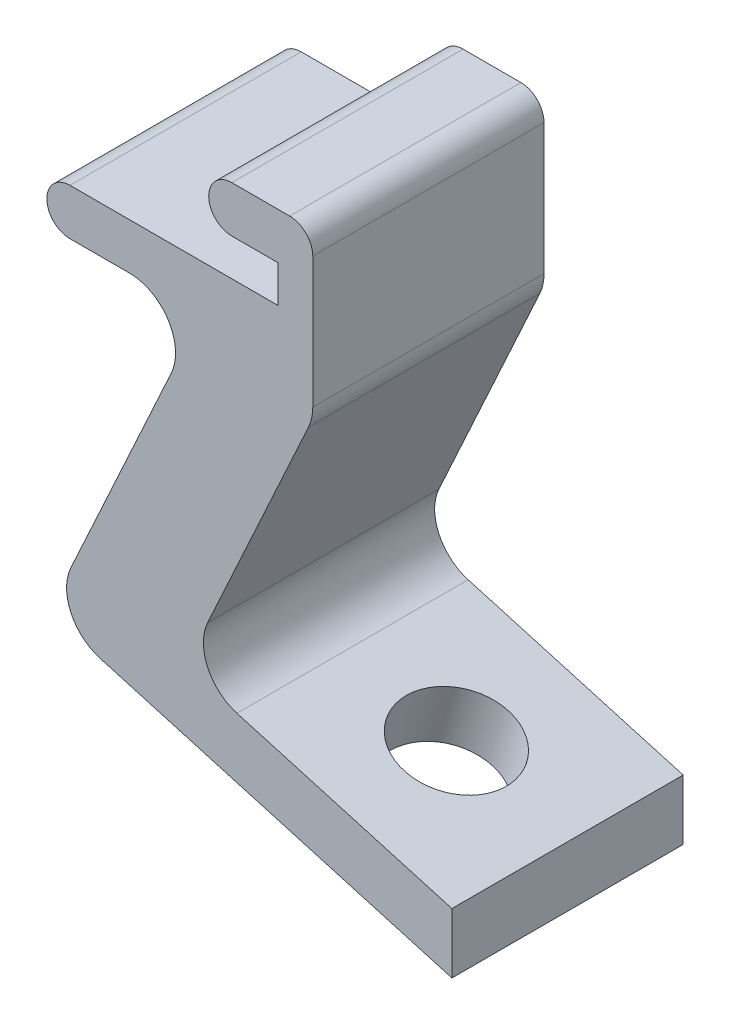
ISO-10303-21;
HEADER;
FILE_DESCRIPTION(('STEP AP214'),'2;1');
FILE_NAME('part.step','',(''),(''),'','','');
FILE_SCHEMA(('AUTOMOTIVE_DESIGN { 1 0 10303 214 1 1 1 1 }'));
ENDSEC;
DATA;
#1=APPLICATION_CONTEXT('core data for automotive mechanical design processes');
#2=APPLICATION_PROTOCOL_DEFINITION('international standard','automotive_design',2000,#1);
#3=PRODUCT_CONTEXT('',#1,'mechanical');
#4=PRODUCT('Part','Part','',(#3));
#5=PRODUCT_RELATED_PRODUCT_CATEGORY('part','',(#4));
#6=PRODUCT_DEFINITION_FORMATION('','',#4);
#7=PRODUCT_DEFINITION_CONTEXT('part definition',#1,'design');
#8=PRODUCT_DEFINITION('design','',#6,#7);
#9=PRODUCT_DEFINITION_SHAPE('','',#8);
#10=(LENGTH_UNIT() NAMED_UNIT(*) SI_UNIT(.MILLI.,.METRE.));
#11=(NAMED_UNIT(*) PLANE_ANGLE_UNIT() SI_UNIT($,.RADIAN.));
#12=(NAMED_UNIT(*) SI_UNIT($,.STERADIAN.) SOLID_ANGLE_UNIT());
#13=UNCERTAINTY_MEASURE_WITH_UNIT(LENGTH_MEASURE(1.E-05),#10,'distance_accuracy_value','');
#14=(GEOMETRIC_REPRESENTATION_CONTEXT(3) GLOBAL_UNCERTAINTY_ASSIGNED_CONTEXT((#13)) GLOBAL_UNIT_ASSIGNED_CONTEXT((#10,
#11,#12)) REPRESENTATION_CONTEXT('',''));
#15=CARTESIAN_POINT('',(0.,0.,0.));
#16=DIRECTION('',(0.,0.,1.));
#17=DIRECTION('',(1.,0.,0.));
#18=AXIS2_PLACEMENT_3D('',#15,#16,#17);
#19=CARTESIAN_POINT('',(-5.64587358932212,-8.77244875286067,10.));
#20=DIRECTION('',(0.,0.,-1.));
#21=DIRECTION('',(-1.,0.,0.));
#22=AXIS2_PLACEMENT_3D('',#19,#20,#21);
#23=CYLINDRICAL_SURFACE('',#22,2.);
#24=CARTESIAN_POINT('',(-5.64587358932212,-8.77244875286067,0.));
#25=DIRECTION('',(0.,0.,1.));
#26=DIRECTION('',(1.,0.,0.));
#27=AXIS2_PLACEMENT_3D('',#24,#25,#26);
#28=CIRCLE('',#27,2.);
#29=CARTESIAN_POINT('',(-7.46359977285942,-7.93825961262753,0.));
#30=VERTEX_POINT('',#29);
#31=CARTESIAN_POINT('',(-6.19714830095609,-10.6949721447373,0.));
#32=VERTEX_POINT('',#31);
#33=EDGE_CURVE('E194',#30,#32,#28,.T.);
#34=ORIENTED_EDGE('',*,*,#33,.T.);
#35=DIRECTION('',(0.,0.,-1.));
#36=VECTOR('',#35,1.);
#37=CARTESIAN_POINT('',(-6.19714830095609,-10.6949721447373,10.));
#38=LINE('',#37,#36);
#39=CARTESIAN_POINT('',(-6.19714830095609,-10.6949721447373,10.));
#40=VERTEX_POINT('',#39);
#41=EDGE_CURVE('E176',#40,#32,#38,.T.);
#42=ORIENTED_EDGE('',*,*,#41,.F.);
#43=CARTESIAN_POINT('',(-5.64587358932212,-8.77244875286067,10.));
#44=DIRECTION('',(0.,0.,1.));
#45=DIRECTION('',(1.,0.,0.));
#46=AXIS2_PLACEMENT_3D('',#43,#44,#45);
#47=CIRCLE('',#46,2.);
#48=CARTESIAN_POINT('',(-7.46359977285942,-7.93825961262753,10.));
#49=VERTEX_POINT('',#48);
#50=EDGE_CURVE('E182',#49,#40,#47,.T.);
#51=ORIENTED_EDGE('',*,*,#50,.F.);
#52=DIRECTION('',(0.,0.,-1.));
#53=VECTOR('',#52,1.);
#54=CARTESIAN_POINT('',(-7.46359977285942,-7.93825961262753,10.));
#55=LINE('',#54,#53);
#56=EDGE_CURVE('E274',#49,#30,#55,.T.);
#57=ORIENTED_EDGE('',*,*,#56,.T.);
#58=EDGE_LOOP('',(#34,#42,#51,#57));
#59=FACE_BOUND('',#58,.T.);
#60=ADVANCED_FACE('F36',(#59),#23,.T.);
#61=CARTESIAN_POINT('',(9.01718824571801,-15.0576129468776,10.));
#62=DIRECTION('',(0.275637355816992,0.961261695938321,0.));
#63=DIRECTION('',(-0.961261695938321,0.275637355816992,0.));
#64=AXIS2_PLACEMENT_3D('',#61,#62,#63);
#65=PLANE('',#64);
#66=CARTESIAN_POINT('',(3.52178637648393,-13.4818318179844,5.));
#67=DIRECTION('',(0.275637355816992,0.961261695938321,0.));
#68=DIRECTION('',(-0.961261695938321,0.275637355816992,0.));
#69=AXIS2_PLACEMENT_3D('',#66,#67,#68);
#70=CIRCLE('',#69,2.25);
#71=CARTESIAN_POINT('',(1.3589475606227,-12.8616477673962,5.));
#72=VERTEX_POINT('',#71);
#73=EDGE_CURVE('E237',#72,#72,#70,.T.);
#74=ORIENTED_EDGE('',*,*,#73,.T.);
#75=EDGE_LOOP('',(#74));
#76=FACE_BOUND('',#75,.T.);
#77=DIRECTION('',(0.961261695938321,-0.275637355816992,0.));
#78=VECTOR('',#77,1.);
#79=CARTESIAN_POINT('',(9.01718824571801,-15.0576129468776,0.));
#80=LINE('',#79,#78);
#81=CARTESIAN_POINT('',(9.01718824571801,-15.0576129468776,0.));
#82=VERTEX_POINT('',#81);
#83=EDGE_CURVE('E234',#32,#82,#80,.T.);
#84=ORIENTED_EDGE('',*,*,#83,.T.);
#85=DIRECTION('',(0.,0.,-1.));
#86=VECTOR('',#85,1.);
#87=CARTESIAN_POINT('',(9.01718824571801,-15.0576129468776,10.));
#88=LINE('',#87,#86);
#89=CARTESIAN_POINT('',(9.01718824571801,-15.0576129468776,10.));
#90=VERTEX_POINT('',#89);
#91=EDGE_CURVE('E179',#90,#82,#88,.T.);
#92=ORIENTED_EDGE('',*,*,#91,.F.);
#93=DIRECTION('',(0.961261695938321,-0.275637355816992,0.));
#94=VECTOR('',#93,1.);
#95=CARTESIAN_POINT('',(9.01718824571801,-15.0576129468776,10.));
#96=LINE('',#95,#94);
#97=EDGE_CURVE('E172',#40,#90,#96,.T.);
#98=ORIENTED_EDGE('',*,*,#97,.F.);
#99=ORIENTED_EDGE('',*,*,#41,.T.);
#100=EDGE_LOOP('',(#84,#92,#98,#99));
#101=FACE_BOUND('',#100,.T.);
#102=ADVANCED_FACE('F174',(#76,#101),#65,.F.);
#103=CARTESIAN_POINT('',(9.01718824571801,-12.4568643572236,10.));
#104=DIRECTION('',(-1.,0.,0.));
#105=DIRECTION('',(0.,0.,1.));
#106=AXIS2_PLACEMENT_3D('',#103,#104,#105);
#107=PLANE('',#106);
#108=DIRECTION('',(0.,1.,0.));
#109=VECTOR('',#108,1.);
#110=CARTESIAN_POINT('',(9.01718824571801,-12.4568643572236,0.));
#111=LINE('',#110,#109);
#112=CARTESIAN_POINT('',(9.01718824571801,-12.4568643572236,0.));
#113=VERTEX_POINT('',#112);
#114=EDGE_CURVE('E277',#82,#113,#111,.T.);
#115=ORIENTED_EDGE('',*,*,#114,.T.);
#116=DIRECTION('',(0.,0.,-1.));
#117=VECTOR('',#116,1.);
#118=CARTESIAN_POINT('',(9.01718824571801,-12.4568643572236,10.));
#119=LINE('',#118,#117);
#120=CARTESIAN_POINT('',(9.01718824571801,-12.4568643572236,10.));
#121=VERTEX_POINT('',#120);
#122=EDGE_CURVE('E199',#121,#113,#119,.T.);
#123=ORIENTED_EDGE('',*,*,#122,.F.);
#124=DIRECTION('',(0.,1.,0.));
#125=VECTOR('',#124,1.);
#126=CARTESIAN_POINT('',(9.01718824571801,-12.4568643572236,10.));
#127=LINE('',#126,#125);
#128=EDGE_CURVE('E181',#90,#121,#127,.T.);
#129=ORIENTED_EDGE('',*,*,#128,.F.);
#130=ORIENTED_EDGE('',*,*,#91,.T.);
#131=EDGE_LOOP('',(#115,#123,#129,#130));
#132=FACE_BOUND('',#131,.T.);
#133=ADVANCED_FACE('F354',(#132),#107,.F.);
#134=CARTESIAN_POINT('',(-0.280787764041095,-9.79071263952915,10.));
#135=DIRECTION('',(-0.275637355816992,-0.961261695938321,0.));
#136=DIRECTION('',(0.961261695938321,-0.275637355816992,0.));
#137=AXIS2_PLACEMENT_3D('',#134,#135,#136);
#138=PLANE('',#137);
#139=CARTESIAN_POINT('',(4.21087976602641,-11.0786775781386,5.));
#140=DIRECTION('',(0.275637355816992,0.961261695938321,0.));
#141=DIRECTION('',(-0.961261695938321,0.275637355816992,0.));
#142=AXIS2_PLACEMENT_3D('',#139,#140,#141);
#143=CIRCLE('',#142,2.25);
#144=CARTESIAN_POINT('',(2.04804095016518,-10.4584935275504,5.));
#145=VERTEX_POINT('',#144);
#146=EDGE_CURVE('E242',#145,#145,#143,.T.);
#147=ORIENTED_EDGE('',*,*,#146,.F.);
#148=EDGE_LOOP('',(#147));
#149=FACE_BOUND('',#148,.T.);
#150=DIRECTION('',(-0.961261695938321,0.275637355816992,0.));
#151=VECTOR('',#150,1.);
#152=CARTESIAN_POINT('',(-0.280787764041095,-9.79071263952915,0.));
#153=LINE('',#152,#151);
#154=CARTESIAN_POINT('',(-0.280787764041095,-9.79071263952915,0.));
#155=VERTEX_POINT('',#154);
#156=EDGE_CURVE('E279',#113,#155,#153,.T.);
#157=ORIENTED_EDGE('',*,*,#156,.T.);
#158=DIRECTION('',(0.,0.,-1.));
#159=VECTOR('',#158,1.);
#160=CARTESIAN_POINT('',(-0.280787764041095,-9.79071263952915,10.));
#161=LINE('',#160,#159);
#162=CARTESIAN_POINT('',(-0.280787764041095,-9.79071263952915,10.));
#163=VERTEX_POINT('',#162);
#164=EDGE_CURVE('E327',#163,#155,#161,.T.);
#165=ORIENTED_EDGE('',*,*,#164,.F.);
#166=DIRECTION('',(-0.961261695938321,0.275637355816992,0.));
#167=VECTOR('',#166,1.);
#168=CARTESIAN_POINT('',(-0.280787764041095,-9.79071263952915,10.));
#169=LINE('',#168,#167);
#170=EDGE_CURVE('E250',#121,#163,#169,.T.);
#171=ORIENTED_EDGE('',*,*,#170,.F.);
#172=ORIENTED_EDGE('',*,*,#122,.T.);
#173=EDGE_LOOP('',(#157,#165,#171,#172));
#174=FACE_BOUND('',#173,.T.);
#175=ADVANCED_FACE('F334',(#149,#174),#138,.F.);
#176=CARTESIAN_POINT('',(0.270486947592873,-7.8681892476525,10.));
#177=DIRECTION('',(0.,0.,-1.));
#178=DIRECTION('',(-1.,0.,0.));
#179=AXIS2_PLACEMENT_3D('',#176,#177,#178);
#180=CYLINDRICAL_SURFACE('',#179,2.);
#181=CARTESIAN_POINT('',(0.270486947592873,-7.8681892476525,0.));
#182=DIRECTION('',(0.,0.,-1.));
#183=DIRECTION('',(-1.,0.,0.));
#184=AXIS2_PLACEMENT_3D('',#181,#182,#183);
#185=CIRCLE('',#184,2.);
#186=CARTESIAN_POINT('',(-1.54723923594443,-7.03400010741936,0.));
#187=VERTEX_POINT('',#186);
#188=EDGE_CURVE('E281',#155,#187,#185,.T.);
#189=ORIENTED_EDGE('',*,*,#188,.T.);
#190=DIRECTION('',(0.,0.,-1.));
#191=VECTOR('',#190,1.);
#192=CARTESIAN_POINT('',(-1.54723923594443,-7.03400010741936,10.));
#193=LINE('',#192,#191);
#194=CARTESIAN_POINT('',(-1.54723923594443,-7.03400010741936,10.));
#195=VERTEX_POINT('',#194);
#196=EDGE_CURVE('E324',#195,#187,#193,.T.);
#197=ORIENTED_EDGE('',*,*,#196,.F.);
#198=CARTESIAN_POINT('',(0.270486947592873,-7.8681892476525,10.));
#199=DIRECTION('',(0.,0.,-1.));
#200=DIRECTION('',(-1.,0.,0.));
#201=AXIS2_PLACEMENT_3D('',#198,#199,#200);
#202=CIRCLE('',#201,2.);
#203=EDGE_CURVE('E252',#163,#195,#202,.T.);
#204=ORIENTED_EDGE('',*,*,#203,.F.);
#205=ORIENTED_EDGE('',*,*,#164,.T.);
#206=EDGE_LOOP('',(#189,#197,#204,#205));
#207=FACE_BOUND('',#206,.T.);
#208=ADVANCED_FACE('F346',(#207),#180,.F.);
#209=CARTESIAN_POINT('',(2.81772618353731,2.47740629977682,10.));
#210=DIRECTION('',(-0.908863091768655,0.417094570116565,0.));
#211=DIRECTION('',(-0.417094570116565,-0.908863091768655,0.));
#212=AXIS2_PLACEMENT_3D('',#209,#210,#211);
#213=PLANE('',#212);
#214=DIRECTION('',(0.417094570116565,0.908863091768655,0.));
#215=VECTOR('',#214,1.);
#216=CARTESIAN_POINT('',(2.81772618353731,2.47740629977682,0.));
#217=LINE('',#216,#215);
#218=CARTESIAN_POINT('',(2.81772618353731,2.47740629977682,0.));
#219=VERTEX_POINT('',#218);
#220=EDGE_CURVE('E283',#187,#219,#217,.T.);
#221=ORIENTED_EDGE('',*,*,#220,.T.);
#222=DIRECTION('',(0.,0.,-1.));
#223=VECTOR('',#222,1.);
#224=CARTESIAN_POINT('',(2.81772618353731,2.47740629977682,10.));
#225=LINE('',#224,#223);
#226=CARTESIAN_POINT('',(2.81772618353731,2.47740629977682,10.));
#227=VERTEX_POINT('',#226);
#228=EDGE_CURVE('E321',#227,#219,#225,.T.);
#229=ORIENTED_EDGE('',*,*,#228,.F.);
#230=DIRECTION('',(0.417094570116565,0.908863091768655,0.));
#231=VECTOR('',#230,1.);
#232=CARTESIAN_POINT('',(2.81772618353731,2.47740629977682,10.));
#233=LINE('',#232,#231);
#234=EDGE_CURVE('E254',#195,#227,#233,.T.);
#235=ORIENTED_EDGE('',*,*,#234,.F.);
#236=ORIENTED_EDGE('',*,*,#196,.T.);
#237=EDGE_LOOP('',(#221,#229,#235,#236));
#238=FACE_BOUND('',#237,.T.);
#239=ADVANCED_FACE('F350',(#238),#213,.F.);
#240=CARTESIAN_POINT('',(1.,3.31159544000995,10.));
#241=DIRECTION('',(0.,0.,-1.));
#242=DIRECTION('',(-1.,0.,0.));
#243=AXIS2_PLACEMENT_3D('',#240,#241,#242);
#244=CYLINDRICAL_SURFACE('',#243,2.);
#245=CARTESIAN_POINT('',(1.,3.31159544000995,0.));
#246=DIRECTION('',(0.,0.,1.));
#247=DIRECTION('',(-1.,0.,0.));
#248=AXIS2_PLACEMENT_3D('',#245,#246,#247);
#249=CIRCLE('',#248,2.);
#250=CARTESIAN_POINT('',(3.,3.31159544000996,0.));
#251=VERTEX_POINT('',#250);
#252=EDGE_CURVE('E285',#219,#251,#249,.T.);
#253=ORIENTED_EDGE('',*,*,#252,.T.);
#254=DIRECTION('',(0.,0.,-1.));
#255=VECTOR('',#254,1.);
#256=CARTESIAN_POINT('',(3.,3.31159544000996,10.));
#257=LINE('',#256,#255);
#258=CARTESIAN_POINT('',(3.,3.31159544000996,10.));
#259=VERTEX_POINT('',#258);
#260=EDGE_CURVE('E318',#259,#251,#257,.T.);
#261=ORIENTED_EDGE('',*,*,#260,.F.);
#262=CARTESIAN_POINT('',(1.,3.31159544000995,10.));
#263=DIRECTION('',(0.,0.,1.));
#264=DIRECTION('',(-1.,0.,0.));
#265=AXIS2_PLACEMENT_3D('',#262,#263,#264);
#266=CIRCLE('',#265,2.);
#267=EDGE_CURVE('E256',#227,#259,#266,.T.);
#268=ORIENTED_EDGE('',*,*,#267,.F.);
#269=ORIENTED_EDGE('',*,*,#228,.T.);
#270=EDGE_LOOP('',(#253,#261,#268,#269));
#271=FACE_BOUND('',#270,.T.);
#272=ADVANCED_FACE('F440',(#271),#244,.T.);
#273=CARTESIAN_POINT('',(3.,9.97008309957838,10.));
#274=DIRECTION('',(-1.,0.,0.));
#275=DIRECTION('',(0.,0.,1.));
#276=AXIS2_PLACEMENT_3D('',#273,#274,#275);
#277=PLANE('',#276);
#278=DIRECTION('',(0.,1.,0.));
#279=VECTOR('',#278,1.);
#280=CARTESIAN_POINT('',(3.,9.97008309957838,0.));
#281=LINE('',#280,#279);
#282=CARTESIAN_POINT('',(3.,8.97008309957838,0.));
#283=VERTEX_POINT('',#282);
#284=EDGE_CURVE('E287',#251,#283,#281,.T.);
#285=ORIENTED_EDGE('',*,*,#284,.T.);
#286=DIRECTION('',(0.,0.,-1.));
#287=VECTOR('',#286,1.);
#288=CARTESIAN_POINT('',(3.,8.97008309957838,10.));
#289=LINE('',#288,#287);
#290=CARTESIAN_POINT('',(3.,8.97008309957838,10.));
#291=VERTEX_POINT('',#290);
#292=EDGE_CURVE('E45',#283,#291,#289,.F.);
#293=ORIENTED_EDGE('',*,*,#292,.T.);
#294=DIRECTION('',(0.,1.,0.));
#295=VECTOR('',#294,1.);
#296=CARTESIAN_POINT('',(3.,9.97008309957838,10.));
#297=LINE('',#296,#295);
#298=EDGE_CURVE('E258',#259,#291,#297,.T.);
#299=ORIENTED_EDGE('',*,*,#298,.F.);
#300=ORIENTED_EDGE('',*,*,#260,.T.);
#301=EDGE_LOOP('',(#285,#293,#299,#300));
#302=FACE_BOUND('',#301,.T.);
#303=ADVANCED_FACE('F436',(#302),#277,.F.);
#304=CARTESIAN_POINT('',(-1.5,9.97008309957838,10.));
#305=DIRECTION('',(0.,-1.,0.));
#306=DIRECTION('',(0.,0.,-1.));
#307=AXIS2_PLACEMENT_3D('',#304,#305,#306);
#308=PLANE('',#307);
#309=DIRECTION('',(-1.,0.,0.));
#310=VECTOR('',#309,1.);
#311=CARTESIAN_POINT('',(-1.5,9.97008309957838,0.));
#312=LINE('',#311,#310);
#313=CARTESIAN_POINT('',(2.,9.97008309957838,0.));
#314=VERTEX_POINT('',#313);
#315=CARTESIAN_POINT('',(-0.5,9.97008309957838,0.));
#316=VERTEX_POINT('',#315);
#317=EDGE_CURVE('E290',#314,#316,#312,.T.);
#318=ORIENTED_EDGE('',*,*,#317,.T.);
#319=DIRECTION('',(0.,0.,-1.));
#320=VECTOR('',#319,1.);
#321=CARTESIAN_POINT('',(-0.5,9.97008309957838,10.));
#322=LINE('',#321,#320);
#323=CARTESIAN_POINT('',(-0.5,9.97008309957838,10.));
#324=VERTEX_POINT('',#323);
#325=EDGE_CURVE('E227',#316,#324,#322,.F.);
#326=ORIENTED_EDGE('',*,*,#325,.T.);
#327=DIRECTION('',(-1.,0.,0.));
#328=VECTOR('',#327,1.);
#329=CARTESIAN_POINT('',(-1.5,9.97008309957838,10.));
#330=LINE('',#329,#328);
#331=CARTESIAN_POINT('',(2.,9.97008309957838,10.));
#332=VERTEX_POINT('',#331);
#333=EDGE_CURVE('E261',#332,#324,#330,.T.);
#334=ORIENTED_EDGE('',*,*,#333,.F.);
#335=DIRECTION('',(0.,0.,-1.));
#336=VECTOR('',#335,1.);
#337=CARTESIAN_POINT('',(2.,9.97008309957838,10.));
#338=LINE('',#337,#336);
#339=EDGE_CURVE('E224',#332,#314,#338,.T.);
#340=ORIENTED_EDGE('',*,*,#339,.T.);
#341=EDGE_LOOP('',(#318,#326,#334,#340));
#342=FACE_BOUND('',#341,.T.);
#343=ADVANCED_FACE('F433',(#342),#308,.F.);
#344=CARTESIAN_POINT('',(-1.5,7.97008309957838,10.));
#345=DIRECTION('',(0.,1.,0.));
#346=DIRECTION('',(0.,0.,1.));
#347=AXIS2_PLACEMENT_3D('',#344,#345,#346);
#348=PLANE('',#347);
#349=DIRECTION('',(1.,0.,0.));
#350=VECTOR('',#349,1.);
#351=CARTESIAN_POINT('',(-1.5,7.97008309957838,10.));
#352=LINE('',#351,#350);
#353=CARTESIAN_POINT('',(-0.5,7.97008309957838,10.));
#354=VERTEX_POINT('',#353);
#355=CARTESIAN_POINT('',(1.5,7.97008309957838,10.));
#356=VERTEX_POINT('',#355);
#357=EDGE_CURVE('E264',#354,#356,#352,.T.);
#358=ORIENTED_EDGE('',*,*,#357,.F.);
#359=DIRECTION('',(0.,0.,-1.));
#360=VECTOR('',#359,1.);
#361=CARTESIAN_POINT('',(-0.5,7.97008309957838,10.));
#362=LINE('',#361,#360);
#363=CARTESIAN_POINT('',(-0.5,7.97008309957838,0.));
#364=VERTEX_POINT('',#363);
#365=EDGE_CURVE('E221',#354,#364,#362,.T.);
#366=ORIENTED_EDGE('',*,*,#365,.T.);
#367=DIRECTION('',(1.,0.,0.));
#368=VECTOR('',#367,1.);
#369=CARTESIAN_POINT('',(-1.5,7.97008309957838,0.));
#370=LINE('',#369,#368);
#371=CARTESIAN_POINT('',(1.5,7.97008309957838,0.));
#372=VERTEX_POINT('',#371);
#373=EDGE_CURVE('E293',#364,#372,#370,.T.);
#374=ORIENTED_EDGE('',*,*,#373,.T.);
#375=DIRECTION('',(0.,0.,-1.));
#376=VECTOR('',#375,1.);
#377=CARTESIAN_POINT('',(1.5,7.97008309957838,10.));
#378=LINE('',#377,#376);
#379=EDGE_CURVE('E315',#356,#372,#378,.T.);
#380=ORIENTED_EDGE('',*,*,#379,.F.);
#381=EDGE_LOOP('',(#358,#366,#374,#380));
#382=FACE_BOUND('',#381,.T.);
#383=ADVANCED_FACE('F390',(#382),#348,.F.);
#384=CARTESIAN_POINT('',(1.5,7.97008309957838,10.));
#385=DIRECTION('',(1.,0.,0.));
#386=DIRECTION('',(0.,0.,-1.));
#387=AXIS2_PLACEMENT_3D('',#384,#385,#386);
#388=PLANE('',#387);
#389=DIRECTION('',(0.,-1.,0.));
#390=VECTOR('',#389,1.);
#391=CARTESIAN_POINT('',(1.5,7.97008309957838,0.));
#392=LINE('',#391,#390);
#393=CARTESIAN_POINT('',(1.5,6.37008309957838,0.));
#394=VERTEX_POINT('',#393);
#395=EDGE_CURVE('E295',#372,#394,#392,.T.);
#396=ORIENTED_EDGE('',*,*,#395,.T.);
#397=DIRECTION('',(0.,0.,-1.));
#398=VECTOR('',#397,1.);
#399=CARTESIAN_POINT('',(1.5,6.37008309957838,10.));
#400=LINE('',#399,#398);
#401=CARTESIAN_POINT('',(1.5,6.37008309957838,10.));
#402=VERTEX_POINT('',#401);
#403=EDGE_CURVE('E312',#402,#394,#400,.T.);
#404=ORIENTED_EDGE('',*,*,#403,.F.);
#405=DIRECTION('',(0.,-1.,0.));
#406=VECTOR('',#405,1.);
#407=CARTESIAN_POINT('',(1.5,7.97008309957838,10.));
#408=LINE('',#407,#406);
#409=EDGE_CURVE('E266',#356,#402,#408,.T.);
#410=ORIENTED_EDGE('',*,*,#409,.F.);
#411=ORIENTED_EDGE('',*,*,#379,.T.);
#412=EDGE_LOOP('',(#396,#404,#410,#411));
#413=FACE_BOUND('',#412,.T.);
#414=ADVANCED_FACE('F395',(#413),#388,.F.);
#415=CARTESIAN_POINT('',(1.5,6.37008309957838,10.));
#416=DIRECTION('',(0.,-1.,0.));
#417=DIRECTION('',(1.,0.,0.));
#418=AXIS2_PLACEMENT_3D('',#415,#416,#417);
#419=PLANE('',#418);
#420=DIRECTION('',(-1.,0.,0.));
#421=VECTOR('',#420,1.);
#422=CARTESIAN_POINT('',(1.5,6.37008309957838,0.));
#423=LINE('',#422,#421);
#424=CARTESIAN_POINT('',(-7.5,6.37008309957838,0.));
#425=VERTEX_POINT('',#424);
#426=EDGE_CURVE('E297',#394,#425,#423,.T.);
#427=ORIENTED_EDGE('',*,*,#426,.T.);
#428=DIRECTION('',(0.,0.,-1.));
#429=VECTOR('',#428,1.);
#430=CARTESIAN_POINT('',(-7.5,6.37008309957838,10.));
#431=LINE('',#430,#429);
#432=CARTESIAN_POINT('',(-7.5,6.37008309957838,10.));
#433=VERTEX_POINT('',#432);
#434=EDGE_CURVE('E210',#425,#433,#431,.F.);
#435=ORIENTED_EDGE('',*,*,#434,.T.);
#436=DIRECTION('',(-1.,0.,0.));
#437=VECTOR('',#436,1.);
#438=CARTESIAN_POINT('',(1.5,6.37008309957838,10.));
#439=LINE('',#438,#437);
#440=EDGE_CURVE('E268',#402,#433,#439,.T.);
#441=ORIENTED_EDGE('',*,*,#440,.F.);
#442=ORIENTED_EDGE('',*,*,#403,.T.);
#443=EDGE_LOOP('',(#427,#435,#441,#442));
#444=FACE_BOUND('',#443,.T.);
#445=ADVANCED_FACE('F398',(#444),#419,.F.);
#446=CARTESIAN_POINT('',(-8.5,4.37008309957838,10.));
#447=DIRECTION('',(0.,1.,0.));
#448=DIRECTION('',(0.,0.,1.));
#449=AXIS2_PLACEMENT_3D('',#446,#447,#448);
#450=PLANE('',#449);
#451=DIRECTION('',(1.,0.,0.));
#452=VECTOR('',#451,1.);
#453=CARTESIAN_POINT('',(-8.5,4.37008309957838,10.));
#454=LINE('',#453,#452);
#455=CARTESIAN_POINT('',(-7.5,4.37008309957838,10.));
#456=VERTEX_POINT('',#455);
#457=CARTESIAN_POINT('',(-4.93345657198768,4.37008309957838,10.));
#458=VERTEX_POINT('',#457);
#459=EDGE_CURVE('E270',#456,#458,#454,.T.);
#460=ORIENTED_EDGE('',*,*,#459,.F.);
#461=DIRECTION('',(0.,0.,-1.));
#462=VECTOR('',#461,1.);
#463=CARTESIAN_POINT('',(-7.5,4.37008309957838,10.));
#464=LINE('',#463,#462);
#465=CARTESIAN_POINT('',(-7.5,4.37008309957838,0.));
#466=VERTEX_POINT('',#465);
#467=EDGE_CURVE('E11',#456,#466,#464,.T.);
#468=ORIENTED_EDGE('',*,*,#467,.T.);
#469=DIRECTION('',(1.,0.,0.));
#470=VECTOR('',#469,1.);
#471=CARTESIAN_POINT('',(-8.5,4.37008309957838,0.));
#472=LINE('',#471,#470);
#473=CARTESIAN_POINT('',(-4.93345657198768,4.37008309957838,0.));
#474=VERTEX_POINT('',#473);
#475=EDGE_CURVE('E300',#466,#474,#472,.T.);
#476=ORIENTED_EDGE('',*,*,#475,.T.);
#477=DIRECTION('',(0.,0.,-1.));
#478=VECTOR('',#477,1.);
#479=CARTESIAN_POINT('',(-4.93345657198768,4.37008309957838,10.));
#480=LINE('',#479,#478);
#481=EDGE_CURVE('E309',#458,#474,#480,.T.);
#482=ORIENTED_EDGE('',*,*,#481,.F.);
#483=EDGE_LOOP('',(#460,#468,#476,#482));
#484=FACE_BOUND('',#483,.T.);
#485=ADVANCED_FACE('F406',(#484),#450,.F.);
#486=CARTESIAN_POINT('',(-4.93345657198766,2.37008309957838,10.));
#487=DIRECTION('',(0.,0.,-1.));
#488=DIRECTION('',(-1.,0.,0.));
#489=AXIS2_PLACEMENT_3D('',#486,#487,#488);
#490=CYLINDRICAL_SURFACE('',#489,2.);
#491=CARTESIAN_POINT('',(-4.93345657198766,2.37008309957838,0.));
#492=DIRECTION('',(0.,0.,-1.));
#493=DIRECTION('',(-1.,0.,0.));
#494=AXIS2_PLACEMENT_3D('',#491,#492,#493);
#495=CIRCLE('',#494,2.);
#496=CARTESIAN_POINT('',(-3.11573038845036,1.53589395934523,0.));
#497=VERTEX_POINT('',#496);
#498=EDGE_CURVE('E302',#474,#497,#495,.T.);
#499=ORIENTED_EDGE('',*,*,#498,.T.);
#500=DIRECTION('',(0.,0.,-1.));
#501=VECTOR('',#500,1.);
#502=CARTESIAN_POINT('',(-3.11573038845036,1.53589395934523,10.));
#503=LINE('',#502,#501);
#504=CARTESIAN_POINT('',(-3.11573038845036,1.53589395934523,10.));
#505=VERTEX_POINT('',#504);
#506=EDGE_CURVE('E306',#505,#497,#503,.T.);
#507=ORIENTED_EDGE('',*,*,#506,.F.);
#508=CARTESIAN_POINT('',(-4.93345657198766,2.37008309957838,10.));
#509=DIRECTION('',(0.,0.,-1.));
#510=DIRECTION('',(-1.,0.,0.));
#511=AXIS2_PLACEMENT_3D('',#508,#509,#510);
#512=CIRCLE('',#511,2.);
#513=EDGE_CURVE('E272',#458,#505,#512,.T.);
#514=ORIENTED_EDGE('',*,*,#513,.F.);
#515=ORIENTED_EDGE('',*,*,#481,.T.);
#516=EDGE_LOOP('',(#499,#507,#514,#515));
#517=FACE_BOUND('',#516,.T.);
#518=ADVANCED_FACE('F411',(#517),#490,.F.);
#519=CARTESIAN_POINT('',(-3.11573038845036,1.53589395934523,10.));
#520=DIRECTION('',(0.908863091768655,-0.417094570116565,0.));
#521=DIRECTION('',(0.417094570116565,0.908863091768655,0.));
#522=AXIS2_PLACEMENT_3D('',#519,#520,#521);
#523=PLANE('',#522);
#524=DIRECTION('',(-0.417094570116565,-0.908863091768655,0.));
#525=VECTOR('',#524,1.);
#526=CARTESIAN_POINT('',(-3.11573038845036,1.53589395934523,0.));
#527=LINE('',#526,#525);
#528=EDGE_CURVE('E191',#497,#30,#527,.T.);
#529=ORIENTED_EDGE('',*,*,#528,.T.);
#530=ORIENTED_EDGE('',*,*,#56,.F.);
#531=DIRECTION('',(-0.417094570116565,-0.908863091768655,0.));
#532=VECTOR('',#531,1.);
#533=CARTESIAN_POINT('',(-3.11573038845036,1.53589395934523,10.));
#534=LINE('',#533,#532);
#535=EDGE_CURVE('E187',#505,#49,#534,.T.);
#536=ORIENTED_EDGE('',*,*,#535,.F.);
#537=ORIENTED_EDGE('',*,*,#506,.T.);
#538=EDGE_LOOP('',(#529,#530,#536,#537));
#539=FACE_BOUND('',#538,.T.);
#540=ADVANCED_FACE('F414',(#539),#523,.F.);
#541=CARTESIAN_POINT('',(-5.64587358932212,-8.77244875286067,10.));
#542=DIRECTION('',(0.,0.,1.));
#543=DIRECTION('',(1.,0.,0.));
#544=AXIS2_PLACEMENT_3D('',#541,#542,#543);
#545=PLANE('',#544);
#546=CARTESIAN_POINT('',(-0.5,8.97008309957838,10.));
#547=DIRECTION('',(0.,0.,1.));
#548=DIRECTION('',(1.,0.,0.));
#549=AXIS2_PLACEMENT_3D('',#546,#547,#548);
#550=CIRCLE('',#549,1.);
#551=CARTESIAN_POINT('',(-1.5,8.97008309957838,10.));
#552=VERTEX_POINT('',#551);
#553=EDGE_CURVE('E217',#324,#552,#550,.T.);
#554=ORIENTED_EDGE('',*,*,#553,.T.);
#555=CARTESIAN_POINT('',(-0.5,8.97008309957838,10.));
#556=DIRECTION('',(0.,0.,1.));
#557=DIRECTION('',(1.,0.,0.));
#558=AXIS2_PLACEMENT_3D('',#555,#556,#557);
#559=CIRCLE('',#558,1.);
#560=EDGE_CURVE('E219',#552,#354,#559,.T.);
#561=ORIENTED_EDGE('',*,*,#560,.T.);
#562=ORIENTED_EDGE('',*,*,#357,.T.);
#563=ORIENTED_EDGE('',*,*,#409,.T.);
#564=ORIENTED_EDGE('',*,*,#440,.T.);
#565=CARTESIAN_POINT('',(-7.5,5.37008309957838,10.));
#566=DIRECTION('',(0.,0.,1.));
#567=DIRECTION('',(1.,0.,0.));
#568=AXIS2_PLACEMENT_3D('',#565,#566,#567);
#569=CIRCLE('',#568,1.);
#570=CARTESIAN_POINT('',(-8.5,5.37008309957838,10.));
#571=VERTEX_POINT('',#570);
#572=EDGE_CURVE('E58',#433,#571,#569,.T.);
#573=ORIENTED_EDGE('',*,*,#572,.T.);
#574=CARTESIAN_POINT('',(-7.5,5.37008309957838,10.));
#575=DIRECTION('',(0.,0.,1.));
#576=DIRECTION('',(1.,0.,0.));
#577=AXIS2_PLACEMENT_3D('',#574,#575,#576);
#578=CIRCLE('',#577,1.);
#579=EDGE_CURVE('E53',#571,#456,#578,.T.);
#580=ORIENTED_EDGE('',*,*,#579,.T.);
#581=ORIENTED_EDGE('',*,*,#459,.T.);
#582=ORIENTED_EDGE('',*,*,#513,.T.);
#583=ORIENTED_EDGE('',*,*,#535,.T.);
#584=ORIENTED_EDGE('',*,*,#50,.T.);
#585=ORIENTED_EDGE('',*,*,#97,.T.);
#586=ORIENTED_EDGE('',*,*,#128,.T.);
#587=ORIENTED_EDGE('',*,*,#170,.T.);
#588=ORIENTED_EDGE('',*,*,#203,.T.);
#589=ORIENTED_EDGE('',*,*,#234,.T.);
#590=ORIENTED_EDGE('',*,*,#267,.T.);
#591=ORIENTED_EDGE('',*,*,#298,.T.);
#592=CARTESIAN_POINT('',(2.,8.97008309957838,10.));
#593=DIRECTION('',(0.,0.,1.));
#594=DIRECTION('',(1.,0.,0.));
#595=AXIS2_PLACEMENT_3D('',#592,#593,#594);
#596=CIRCLE('',#595,1.);
#597=EDGE_CURVE('E215',#291,#332,#596,.T.);
#598=ORIENTED_EDGE('',*,*,#597,.T.);
#599=ORIENTED_EDGE('',*,*,#333,.T.);
#600=EDGE_LOOP('',(#554,#561,#562,#563,#564,#573,#580,#581,#582,#583,#584,#585,#586,#587,#588,
#589,#590,#591,#598,#599));
#601=FACE_BOUND('',#600,.T.);
#602=ADVANCED_FACE('F185',(#601),#545,.T.);
#603=CARTESIAN_POINT('',(-5.64587358932212,-8.77244875286067,0.));
#604=DIRECTION('',(0.,0.,1.));
#605=DIRECTION('',(1.,0.,0.));
#606=AXIS2_PLACEMENT_3D('',#603,#604,#605);
#607=PLANE('',#606);
#608=ORIENTED_EDGE('',*,*,#373,.F.);
#609=CARTESIAN_POINT('',(-0.5,8.97008309957838,0.));
#610=DIRECTION('',(0.,0.,1.));
#611=DIRECTION('',(1.,0.,0.));
#612=AXIS2_PLACEMENT_3D('',#609,#610,#611);
#613=CIRCLE('',#612,1.);
#614=CARTESIAN_POINT('',(-1.5,8.97008309957838,0.));
#615=VERTEX_POINT('',#614);
#616=EDGE_CURVE('E208',#364,#615,#613,.F.);
#617=ORIENTED_EDGE('',*,*,#616,.T.);
#618=CARTESIAN_POINT('',(-0.5,8.97008309957838,0.));
#619=DIRECTION('',(0.,0.,1.));
#620=DIRECTION('',(1.,0.,0.));
#621=AXIS2_PLACEMENT_3D('',#618,#619,#620);
#622=CIRCLE('',#621,1.);
#623=EDGE_CURVE('E206',#615,#316,#622,.F.);
#624=ORIENTED_EDGE('',*,*,#623,.T.);
#625=ORIENTED_EDGE('',*,*,#317,.F.);
#626=CARTESIAN_POINT('',(2.,8.97008309957838,0.));
#627=DIRECTION('',(0.,0.,1.));
#628=DIRECTION('',(1.,0.,0.));
#629=AXIS2_PLACEMENT_3D('',#626,#627,#628);
#630=CIRCLE('',#629,1.);
#631=EDGE_CURVE('E204',#314,#283,#630,.F.);
#632=ORIENTED_EDGE('',*,*,#631,.T.);
#633=ORIENTED_EDGE('',*,*,#284,.F.);
#634=ORIENTED_EDGE('',*,*,#252,.F.);
#635=ORIENTED_EDGE('',*,*,#220,.F.);
#636=ORIENTED_EDGE('',*,*,#188,.F.);
#637=ORIENTED_EDGE('',*,*,#156,.F.);
#638=ORIENTED_EDGE('',*,*,#114,.F.);
#639=ORIENTED_EDGE('',*,*,#83,.F.);
#640=ORIENTED_EDGE('',*,*,#33,.F.);
#641=ORIENTED_EDGE('',*,*,#528,.F.);
#642=ORIENTED_EDGE('',*,*,#498,.F.);
#643=ORIENTED_EDGE('',*,*,#475,.F.);
#644=CARTESIAN_POINT('',(-7.5,5.37008309957838,0.));
#645=DIRECTION('',(0.,0.,1.));
#646=DIRECTION('',(1.,0.,0.));
#647=AXIS2_PLACEMENT_3D('',#644,#645,#646);
#648=CIRCLE('',#647,1.);
#649=CARTESIAN_POINT('',(-8.5,5.37008309957838,0.));
#650=VERTEX_POINT('',#649);
#651=EDGE_CURVE('E195',#466,#650,#648,.F.);
#652=ORIENTED_EDGE('',*,*,#651,.T.);
#653=CARTESIAN_POINT('',(-7.5,5.37008309957838,0.));
#654=DIRECTION('',(0.,0.,1.));
#655=DIRECTION('',(1.,0.,0.));
#656=AXIS2_PLACEMENT_3D('',#653,#654,#655);
#657=CIRCLE('',#656,1.);
#658=EDGE_CURVE('E197',#650,#425,#657,.F.);
#659=ORIENTED_EDGE('',*,*,#658,.T.);
#660=ORIENTED_EDGE('',*,*,#426,.F.);
#661=ORIENTED_EDGE('',*,*,#395,.F.);
#662=EDGE_LOOP('',(#608,#617,#624,#625,#632,#633,#634,#635,#636,#637,#638,#639,#640,#641,#642,
#643,#652,#659,#660,#661));
#663=FACE_BOUND('',#662,.T.);
#664=ADVANCED_FACE('F341',(#663),#607,.F.);
#665=CARTESIAN_POINT('',(-7.5,5.37008309957838,10.));
#666=DIRECTION('',(0.,0.,-1.));
#667=DIRECTION('',(-1.,0.,0.));
#668=AXIS2_PLACEMENT_3D('',#665,#666,#667);
#669=CYLINDRICAL_SURFACE('',#668,1.);
#670=ORIENTED_EDGE('',*,*,#467,.F.);
#671=ORIENTED_EDGE('',*,*,#579,.F.);
#672=DIRECTION('',(0.,0.,-1.));
#673=VECTOR('',#672,1.);
#674=CARTESIAN_POINT('',(-8.5,5.37008309957838,10.));
#675=LINE('',#674,#673);
#676=EDGE_CURVE('E229',#650,#571,#675,.F.);
#677=ORIENTED_EDGE('',*,*,#676,.F.);
#678=ORIENTED_EDGE('',*,*,#651,.F.);
#679=EDGE_LOOP('',(#670,#671,#677,#678));
#680=FACE_BOUND('',#679,.T.);
#681=ADVANCED_FACE('F373',(#680),#669,.T.);
#682=CARTESIAN_POINT('',(-7.5,5.37008309957838,10.));
#683=DIRECTION('',(0.,0.,-1.));
#684=DIRECTION('',(-1.,0.,0.));
#685=AXIS2_PLACEMENT_3D('',#682,#683,#684);
#686=CYLINDRICAL_SURFACE('',#685,1.);
#687=ORIENTED_EDGE('',*,*,#572,.F.);
#688=ORIENTED_EDGE('',*,*,#434,.F.);
#689=ORIENTED_EDGE('',*,*,#658,.F.);
#690=ORIENTED_EDGE('',*,*,#676,.T.);
#691=EDGE_LOOP('',(#687,#688,#689,#690));
#692=FACE_BOUND('',#691,.T.);
#693=ADVANCED_FACE('F369',(#692),#686,.T.);
#694=CARTESIAN_POINT('',(-0.5,8.97008309957838,10.));
#695=DIRECTION('',(0.,0.,-1.));
#696=DIRECTION('',(-1.,0.,0.));
#697=AXIS2_PLACEMENT_3D('',#694,#695,#696);
#698=CYLINDRICAL_SURFACE('',#697,1.);
#699=DIRECTION('',(0.,0.,-1.));
#700=VECTOR('',#699,1.);
#701=CARTESIAN_POINT('',(-1.5,8.97008309957838,10.));
#702=LINE('',#701,#700);
#703=EDGE_CURVE('E40',#552,#615,#702,.T.);
#704=ORIENTED_EDGE('',*,*,#703,.F.);
#705=ORIENTED_EDGE('',*,*,#553,.F.);
#706=ORIENTED_EDGE('',*,*,#325,.F.);
#707=ORIENTED_EDGE('',*,*,#623,.F.);
#708=EDGE_LOOP('',(#704,#705,#706,#707));
#709=FACE_BOUND('',#708,.T.);
#710=ADVANCED_FACE('F372',(#709),#698,.T.);
#711=CARTESIAN_POINT('',(-0.5,8.97008309957838,10.));
#712=DIRECTION('',(0.,0.,-1.));
#713=DIRECTION('',(-1.,0.,0.));
#714=AXIS2_PLACEMENT_3D('',#711,#712,#713);
#715=CYLINDRICAL_SURFACE('',#714,1.);
#716=ORIENTED_EDGE('',*,*,#560,.F.);
#717=ORIENTED_EDGE('',*,*,#703,.T.);
#718=ORIENTED_EDGE('',*,*,#616,.F.);
#719=ORIENTED_EDGE('',*,*,#365,.F.);
#720=EDGE_LOOP('',(#716,#717,#718,#719));
#721=FACE_BOUND('',#720,.T.);
#722=ADVANCED_FACE('F377',(#721),#715,.T.);
#723=CARTESIAN_POINT('',(2.,8.97008309957838,10.));
#724=DIRECTION('',(0.,0.,-1.));
#725=DIRECTION('',(-1.,0.,0.));
#726=AXIS2_PLACEMENT_3D('',#723,#724,#725);
#727=CYLINDRICAL_SURFACE('',#726,1.);
#728=ORIENTED_EDGE('',*,*,#597,.F.);
#729=ORIENTED_EDGE('',*,*,#292,.F.);
#730=ORIENTED_EDGE('',*,*,#631,.F.);
#731=ORIENTED_EDGE('',*,*,#339,.F.);
#732=EDGE_LOOP('',(#728,#729,#730,#731));
#733=FACE_BOUND('',#732,.T.);
#734=ADVANCED_FACE('F38',(#733),#727,.T.);
#735=CARTESIAN_POINT('',(2.83269298694145,-15.8849860578302,5.));
#736=DIRECTION('',(0.275637355816992,0.961261695938321,0.));
#737=DIRECTION('',(-0.961261695938321,0.275637355816992,0.));
#738=AXIS2_PLACEMENT_3D('',#735,#736,#737);
#739=CYLINDRICAL_SURFACE('',#738,2.25);
#740=ORIENTED_EDGE('',*,*,#146,.T.);
#741=EDGE_LOOP('',(#740));
#742=FACE_BOUND('',#741,.T.);
#743=ORIENTED_EDGE('',*,*,#73,.F.);
#744=EDGE_LOOP('',(#743));
#745=FACE_BOUND('',#744,.T.);
#746=ADVANCED_FACE('F532',(#742,#745),#739,.F.);
#747=CLOSED_SHELL('',(#60,#102,#133,#175,#208,#239,#272,#303,#343,#383,#414,#445,#485,#518,#540,
#602,#664,#681,#693,#710,#722,#734,#746));
#748=MANIFOLD_SOLID_BREP('B2',#747);
#749=ADVANCED_BREP_SHAPE_REPRESENTATION('',(#18,#748),#14);
#750=SHAPE_DEFINITION_REPRESENTATION(#9,#749);
ENDSEC;
END-ISO-10303-21;
